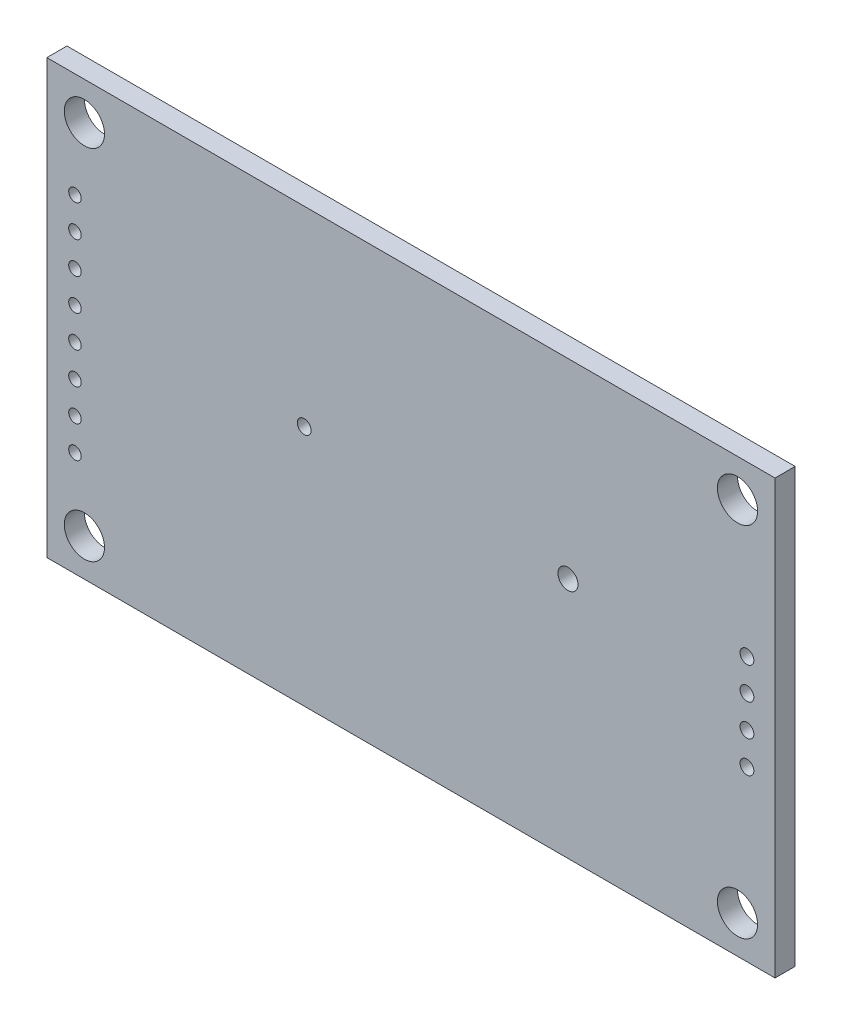
ISO-10303-21;
HEADER;
FILE_DESCRIPTION(('STEP AP214'),'2;1');
FILE_NAME('part.step','',(''),(''),'','','');
FILE_SCHEMA(('AUTOMOTIVE_DESIGN { 1 0 10303 214 1 1 1 1 }'));
ENDSEC;
DATA;
#1=APPLICATION_CONTEXT('core data for automotive mechanical design processes');
#2=APPLICATION_PROTOCOL_DEFINITION('international standard','automotive_design',2000,#1);
#3=PRODUCT_CONTEXT('',#1,'mechanical');
#4=PRODUCT('Part','Part','',(#3));
#5=PRODUCT_RELATED_PRODUCT_CATEGORY('part','',(#4));
#6=PRODUCT_DEFINITION_FORMATION('','',#4);
#7=PRODUCT_DEFINITION_CONTEXT('part definition',#1,'design');
#8=PRODUCT_DEFINITION('design','',#6,#7);
#9=PRODUCT_DEFINITION_SHAPE('','',#8);
#10=(LENGTH_UNIT() NAMED_UNIT(*) SI_UNIT(.MILLI.,.METRE.));
#11=(NAMED_UNIT(*) PLANE_ANGLE_UNIT() SI_UNIT($,.RADIAN.));
#12=(NAMED_UNIT(*) SI_UNIT($,.STERADIAN.) SOLID_ANGLE_UNIT());
#13=UNCERTAINTY_MEASURE_WITH_UNIT(LENGTH_MEASURE(1.E-05),#10,'distance_accuracy_value','');
#14=(GEOMETRIC_REPRESENTATION_CONTEXT(3) GLOBAL_UNCERTAINTY_ASSIGNED_CONTEXT((#13)) GLOBAL_UNIT_ASSIGNED_CONTEXT((#10,
#11,#12)) REPRESENTATION_CONTEXT('',''));
#15=CARTESIAN_POINT('',(0.,0.,0.));
#16=DIRECTION('',(0.,0.,1.));
#17=DIRECTION('',(1.,0.,0.));
#18=AXIS2_PLACEMENT_3D('',#15,#16,#17);
#19=CARTESIAN_POINT('',(29.000058420117,17.250034290069,1.600028244856));
#20=DIRECTION('',(0.,0.,-1.));
#21=DIRECTION('',(0.,-1.,0.));
#22=AXIS2_PLACEMENT_3D('',#19,#20,#21);
#23=PLANE('',#22);
#24=CARTESIAN_POINT('',(55.750111760224,18.520038100076,1.600028244856));
#25=DIRECTION('',(0.,0.,1.));
#26=DIRECTION('',(1.,0.,0.));
#27=AXIS2_PLACEMENT_3D('',#24,#25,#26);
#28=CIRCLE('',#27,0.550012700025);
#29=CARTESIAN_POINT('',(56.300124460249,18.520038100076,1.600028244856));
#30=VERTEX_POINT('',#29);
#31=EDGE_CURVE('E26',#30,#30,#28,.T.);
#32=ORIENTED_EDGE('',*,*,#31,.F.);
#33=EDGE_LOOP('',(#32));
#34=FACE_BOUND('',#33,.T.);
#35=CARTESIAN_POINT('',(55.750111760224,21.060043180086,1.600028244856));
#36=DIRECTION('',(0.,0.,1.));
#37=DIRECTION('',(1.,0.,0.));
#38=AXIS2_PLACEMENT_3D('',#35,#36,#37);
#39=CIRCLE('',#38,0.550012700025);
#40=CARTESIAN_POINT('',(56.300124460249,21.060043180086,1.600028244856));
#41=VERTEX_POINT('',#40);
#42=EDGE_CURVE('E20',#41,#41,#39,.T.);
#43=ORIENTED_EDGE('',*,*,#42,.F.);
#44=EDGE_LOOP('',(#43));
#45=FACE_BOUND('',#44,.T.);
#46=CARTESIAN_POINT('',(55.750111760224,13.440027940056,1.600028244856));
#47=DIRECTION('',(0.,0.,1.));
#48=DIRECTION('',(1.,0.,0.));
#49=AXIS2_PLACEMENT_3D('',#46,#47,#48);
#50=CIRCLE('',#49,0.550012700025);
#51=CARTESIAN_POINT('',(56.300124460249,13.440027940056,1.600028244856));
#52=VERTEX_POINT('',#51);
#53=EDGE_CURVE('E160',#52,#52,#50,.T.);
#54=ORIENTED_EDGE('',*,*,#53,.F.);
#55=EDGE_LOOP('',(#54));
#56=FACE_BOUND('',#55,.T.);
#57=CARTESIAN_POINT('',(55.750111760224,15.980033020066,1.600028244856));
#58=DIRECTION('',(0.,0.,1.));
#59=DIRECTION('',(1.,0.,0.));
#60=AXIS2_PLACEMENT_3D('',#57,#58,#59);
#61=CIRCLE('',#60,0.550012700025);
#62=CARTESIAN_POINT('',(56.300124460249,15.980033020066,1.600028244856));
#63=VERTEX_POINT('',#62);
#64=EDGE_CURVE('E139',#63,#63,#61,.T.);
#65=ORIENTED_EDGE('',*,*,#64,.F.);
#66=EDGE_LOOP('',(#65));
#67=FACE_BOUND('',#66,.T.);
#68=CARTESIAN_POINT('',(55.000109220218,31.500063500127,1.600028244856));
#69=DIRECTION('',(0.,0.,1.));
#70=DIRECTION('',(1.,0.,0.));
#71=AXIS2_PLACEMENT_3D('',#68,#69,#70);
#72=CIRCLE('',#71,1.600002540005);
#73=CARTESIAN_POINT('',(56.600111760223,31.500063500127,1.600028244856));
#74=VERTEX_POINT('',#73);
#75=EDGE_CURVE('E239',#74,#74,#72,.T.);
#76=ORIENTED_EDGE('',*,*,#75,.F.);
#77=EDGE_LOOP('',(#76));
#78=FACE_BOUND('',#77,.T.);
#79=CARTESIAN_POINT('',(55.000109220218,3.00000508001,1.600028244856));
#80=DIRECTION('',(0.,0.,1.));
#81=DIRECTION('',(1.,0.,0.));
#82=AXIS2_PLACEMENT_3D('',#79,#80,#81);
#83=CIRCLE('',#82,1.600002540005);
#84=CARTESIAN_POINT('',(56.600111760223,3.00000508001,1.600028244856));
#85=VERTEX_POINT('',#84);
#86=EDGE_CURVE('E116',#85,#85,#83,.T.);
#87=ORIENTED_EDGE('',*,*,#86,.F.);
#88=EDGE_LOOP('',(#87));
#89=FACE_BOUND('',#88,.T.);
#90=CARTESIAN_POINT('',(41.50016510033,19.288138176276,1.600028244856));
#91=DIRECTION('',(0.,0.,1.));
#92=DIRECTION('',(1.,0.,0.));
#93=AXIS2_PLACEMENT_3D('',#90,#91,#92);
#94=CIRCLE('',#93,0.8);
#95=CARTESIAN_POINT('',(42.30016510033,19.288138176276,1.600028244856));
#96=VERTEX_POINT('',#95);
#97=EDGE_CURVE('E223',#96,#96,#94,.T.);
#98=ORIENTED_EDGE('',*,*,#97,.F.);
#99=EDGE_LOOP('',(#98));
#100=FACE_BOUND('',#99,.T.);
#101=CARTESIAN_POINT('',(20.50016510033,19.288138176276,1.600028244856));
#102=DIRECTION('',(0.,0.,1.));
#103=DIRECTION('',(1.,0.,0.));
#104=AXIS2_PLACEMENT_3D('',#101,#102,#103);
#105=CIRCLE('',#104,0.550012700025);
#106=CARTESIAN_POINT('',(21.050177800355,19.288138176276,1.600028244856));
#107=VERTEX_POINT('',#106);
#108=EDGE_CURVE('E218',#107,#107,#105,.T.);
#109=ORIENTED_EDGE('',*,*,#108,.F.);
#110=EDGE_LOOP('',(#109));
#111=FACE_BOUND('',#110,.T.);
#112=CARTESIAN_POINT('',(2.25000508001,26.140053340107,1.600028244856));
#113=DIRECTION('',(0.,0.,1.));
#114=DIRECTION('',(1.,0.,0.));
#115=AXIS2_PLACEMENT_3D('',#112,#113,#114);
#116=CIRCLE('',#115,0.5);
#117=CARTESIAN_POINT('',(2.75000508001,26.140053340107,1.600028244856));
#118=VERTEX_POINT('',#117);
#119=EDGE_CURVE('E168',#118,#118,#116,.T.);
#120=ORIENTED_EDGE('',*,*,#119,.F.);
#121=EDGE_LOOP('',(#120));
#122=FACE_BOUND('',#121,.T.);
#123=CARTESIAN_POINT('',(2.25000508001,18.520038100076,1.600028244856));
#124=DIRECTION('',(0.,0.,1.));
#125=DIRECTION('',(1.,0.,0.));
#126=AXIS2_PLACEMENT_3D('',#123,#124,#125);
#127=CIRCLE('',#126,0.5);
#128=CARTESIAN_POINT('',(2.75000508001,18.520038100076,1.600028244856));
#129=VERTEX_POINT('',#128);
#130=EDGE_CURVE('E182',#129,#129,#127,.T.);
#131=ORIENTED_EDGE('',*,*,#130,.F.);
#132=EDGE_LOOP('',(#131));
#133=FACE_BOUND('',#132,.T.);
#134=CARTESIAN_POINT('',(2.25000508001,21.060043180086,1.600028244856));
#135=DIRECTION('',(0.,0.,1.));
#136=DIRECTION('',(1.,0.,0.));
#137=AXIS2_PLACEMENT_3D('',#134,#135,#136);
#138=CIRCLE('',#137,0.5);
#139=CARTESIAN_POINT('',(2.75000508001,21.060043180086,1.600028244856));
#140=VERTEX_POINT('',#139);
#141=EDGE_CURVE('E183',#140,#140,#138,.T.);
#142=ORIENTED_EDGE('',*,*,#141,.F.);
#143=EDGE_LOOP('',(#142));
#144=FACE_BOUND('',#143,.T.);
#145=CARTESIAN_POINT('',(2.25000508001,23.600048260097,1.600028244856));
#146=DIRECTION('',(0.,0.,1.));
#147=DIRECTION('',(1.,0.,0.));
#148=AXIS2_PLACEMENT_3D('',#145,#146,#147);
#149=CIRCLE('',#148,0.5);
#150=CARTESIAN_POINT('',(2.75000508001,23.600048260097,1.600028244856));
#151=VERTEX_POINT('',#150);
#152=EDGE_CURVE('E201',#151,#151,#149,.T.);
#153=ORIENTED_EDGE('',*,*,#152,.F.);
#154=EDGE_LOOP('',(#153));
#155=FACE_BOUND('',#154,.T.);
#156=CARTESIAN_POINT('',(2.25000508001,8.360017780036,1.600028244856));
#157=DIRECTION('',(0.,0.,1.));
#158=DIRECTION('',(1.,0.,0.));
#159=AXIS2_PLACEMENT_3D('',#156,#157,#158);
#160=CIRCLE('',#159,0.5);
#161=CARTESIAN_POINT('',(2.75000508001,8.360017780036,1.600028244856));
#162=VERTEX_POINT('',#161);
#163=EDGE_CURVE('E193',#162,#162,#160,.T.);
#164=ORIENTED_EDGE('',*,*,#163,.F.);
#165=EDGE_LOOP('',(#164));
#166=FACE_BOUND('',#165,.T.);
#167=CARTESIAN_POINT('',(2.25000508001,10.900022860046,1.600028244856));
#168=DIRECTION('',(0.,0.,1.));
#169=DIRECTION('',(1.,0.,0.));
#170=AXIS2_PLACEMENT_3D('',#167,#168,#169);
#171=CIRCLE('',#170,0.5);
#172=CARTESIAN_POINT('',(2.75000508001,10.900022860046,1.600028244856));
#173=VERTEX_POINT('',#172);
#174=EDGE_CURVE('E110',#173,#173,#171,.T.);
#175=ORIENTED_EDGE('',*,*,#174,.F.);
#176=EDGE_LOOP('',(#175));
#177=FACE_BOUND('',#176,.T.);
#178=CARTESIAN_POINT('',(2.25000508001,13.440027940056,1.600028244856));
#179=DIRECTION('',(0.,0.,1.));
#180=DIRECTION('',(1.,0.,0.));
#181=AXIS2_PLACEMENT_3D('',#178,#179,#180);
#182=CIRCLE('',#181,0.5);
#183=CARTESIAN_POINT('',(2.75000508001,13.440027940056,1.600028244856));
#184=VERTEX_POINT('',#183);
#185=EDGE_CURVE('E148',#184,#184,#182,.T.);
#186=ORIENTED_EDGE('',*,*,#185,.F.);
#187=EDGE_LOOP('',(#186));
#188=FACE_BOUND('',#187,.T.);
#189=CARTESIAN_POINT('',(2.25000508001,15.980033020066,1.600028244856));
#190=DIRECTION('',(0.,0.,1.));
#191=DIRECTION('',(1.,0.,0.));
#192=AXIS2_PLACEMENT_3D('',#189,#190,#191);
#193=CIRCLE('',#192,0.5);
#194=CARTESIAN_POINT('',(2.75000508001,15.980033020066,1.600028244856));
#195=VERTEX_POINT('',#194);
#196=EDGE_CURVE('E167',#195,#195,#193,.T.);
#197=ORIENTED_EDGE('',*,*,#196,.F.);
#198=EDGE_LOOP('',(#197));
#199=FACE_BOUND('',#198,.T.);
#200=CARTESIAN_POINT('',(3.00000508001,31.500063500127,1.600028244856));
#201=DIRECTION('',(0.,0.,1.));
#202=DIRECTION('',(1.,0.,0.));
#203=AXIS2_PLACEMENT_3D('',#200,#201,#202);
#204=CIRCLE('',#203,1.600002540005);
#205=CARTESIAN_POINT('',(4.600007620015,31.500063500127,1.600028244856));
#206=VERTEX_POINT('',#205);
#207=EDGE_CURVE('E124',#206,#206,#204,.T.);
#208=ORIENTED_EDGE('',*,*,#207,.F.);
#209=EDGE_LOOP('',(#208));
#210=FACE_BOUND('',#209,.T.);
#211=CARTESIAN_POINT('',(3.00000508001,3.00000508001,1.600028244856));
#212=DIRECTION('',(0.,0.,1.));
#213=DIRECTION('',(1.,0.,0.));
#214=AXIS2_PLACEMENT_3D('',#211,#212,#213);
#215=CIRCLE('',#214,1.600002540005);
#216=CARTESIAN_POINT('',(4.600007620015,3.00000508001,1.600028244856));
#217=VERTEX_POINT('',#216);
#218=EDGE_CURVE('E136',#217,#217,#215,.T.);
#219=ORIENTED_EDGE('',*,*,#218,.F.);
#220=EDGE_LOOP('',(#219));
#221=FACE_BOUND('',#220,.T.);
#222=DIRECTION('',(0.,-1.,0.));
#223=VECTOR('',#222,1.);
#224=CARTESIAN_POINT('',(57.987416814834,34.487368554737,1.600028244856));
#225=LINE('',#224,#223);
#226=CARTESIAN_POINT('',(57.987416814834,34.487368554737,1.600028244856));
#227=VERTEX_POINT('',#226);
#228=CARTESIAN_POINT('',(57.987416814834,0.01270002540005,1.600028244856));
#229=VERTEX_POINT('',#228);
#230=EDGE_CURVE('E106',#227,#229,#225,.T.);
#231=ORIENTED_EDGE('',*,*,#230,.F.);
#232=DIRECTION('',(1.,0.,0.));
#233=VECTOR('',#232,1.);
#234=CARTESIAN_POINT('',(0.01270002540005,34.487368554737,1.600028244856));
#235=LINE('',#234,#233);
#236=CARTESIAN_POINT('',(0.01270002540005,34.487368554737,1.600028244856));
#237=VERTEX_POINT('',#236);
#238=EDGE_CURVE('E49',#237,#227,#235,.T.);
#239=ORIENTED_EDGE('',*,*,#238,.F.);
#240=DIRECTION('',(0.,1.,0.));
#241=VECTOR('',#240,1.);
#242=CARTESIAN_POINT('',(0.01270002540005,0.01270002540005,1.600028244856));
#243=LINE('',#242,#241);
#244=CARTESIAN_POINT('',(0.01270002540005,0.01270002540005,1.600028244856));
#245=VERTEX_POINT('',#244);
#246=EDGE_CURVE('E72',#245,#237,#243,.T.);
#247=ORIENTED_EDGE('',*,*,#246,.F.);
#248=DIRECTION('',(-1.,0.,0.));
#249=VECTOR('',#248,1.);
#250=CARTESIAN_POINT('',(57.987416814834,0.01270002540005,1.600028244856));
#251=LINE('',#250,#249);
#252=EDGE_CURVE('E75',#229,#245,#251,.T.);
#253=ORIENTED_EDGE('',*,*,#252,.F.);
#254=EDGE_LOOP('',(#231,#239,#247,#253));
#255=FACE_BOUND('',#254,.T.);
#256=ADVANCED_FACE('F17',(#34,#45,#56,#67,#78,#89,#100,#111,#122,#133,#144,#155,#166,#177,#188,
#199,#210,#221,#255),#23,.F.);
#257=CARTESIAN_POINT('',(29.000058420117,17.250034290069,0.));
#258=DIRECTION('',(0.,0.,-1.));
#259=DIRECTION('',(0.,-1.,0.));
#260=AXIS2_PLACEMENT_3D('',#257,#258,#259);
#261=PLANE('',#260);
#262=CARTESIAN_POINT('',(55.750111760224,18.520038100076,0.));
#263=DIRECTION('',(0.,0.,1.));
#264=DIRECTION('',(-1.,0.,0.));
#265=AXIS2_PLACEMENT_3D('',#262,#263,#264);
#266=CIRCLE('',#265,0.550012700025);
#267=CARTESIAN_POINT('',(55.200099060199,18.520038100076,0.));
#268=VERTEX_POINT('',#267);
#269=EDGE_CURVE('E11',#268,#268,#266,.T.);
#270=ORIENTED_EDGE('',*,*,#269,.T.);
#271=EDGE_LOOP('',(#270));
#272=FACE_BOUND('',#271,.T.);
#273=CARTESIAN_POINT('',(55.750111760224,21.060043180086,0.));
#274=DIRECTION('',(0.,0.,1.));
#275=DIRECTION('',(-1.,0.,0.));
#276=AXIS2_PLACEMENT_3D('',#273,#274,#275);
#277=CIRCLE('',#276,0.550012700025);
#278=CARTESIAN_POINT('',(55.200099060199,21.060043180086,0.));
#279=VERTEX_POINT('',#278);
#280=EDGE_CURVE('E133',#279,#279,#277,.T.);
#281=ORIENTED_EDGE('',*,*,#280,.T.);
#282=EDGE_LOOP('',(#281));
#283=FACE_BOUND('',#282,.T.);
#284=CARTESIAN_POINT('',(55.750111760224,13.440027940056,0.));
#285=DIRECTION('',(0.,0.,1.));
#286=DIRECTION('',(-1.,0.,0.));
#287=AXIS2_PLACEMENT_3D('',#284,#285,#286);
#288=CIRCLE('',#287,0.550012700025);
#289=CARTESIAN_POINT('',(55.200099060199,13.440027940056,0.));
#290=VERTEX_POINT('',#289);
#291=EDGE_CURVE('E156',#290,#290,#288,.T.);
#292=ORIENTED_EDGE('',*,*,#291,.T.);
#293=EDGE_LOOP('',(#292));
#294=FACE_BOUND('',#293,.T.);
#295=CARTESIAN_POINT('',(55.750111760224,15.980033020066,0.));
#296=DIRECTION('',(0.,0.,1.));
#297=DIRECTION('',(-1.,0.,0.));
#298=AXIS2_PLACEMENT_3D('',#295,#296,#297);
#299=CIRCLE('',#298,0.550012700025);
#300=CARTESIAN_POINT('',(55.200099060199,15.980033020066,0.));
#301=VERTEX_POINT('',#300);
#302=EDGE_CURVE('E142',#301,#301,#299,.T.);
#303=ORIENTED_EDGE('',*,*,#302,.T.);
#304=EDGE_LOOP('',(#303));
#305=FACE_BOUND('',#304,.T.);
#306=CARTESIAN_POINT('',(55.000109220218,31.500063500127,0.));
#307=DIRECTION('',(0.,0.,1.));
#308=DIRECTION('',(-1.,0.,0.));
#309=AXIS2_PLACEMENT_3D('',#306,#307,#308);
#310=CIRCLE('',#309,1.600002540005);
#311=CARTESIAN_POINT('',(53.400106680213,31.500063500127,0.));
#312=VERTEX_POINT('',#311);
#313=EDGE_CURVE('E143',#312,#312,#310,.T.);
#314=ORIENTED_EDGE('',*,*,#313,.T.);
#315=EDGE_LOOP('',(#314));
#316=FACE_BOUND('',#315,.T.);
#317=CARTESIAN_POINT('',(55.000109220218,3.00000508001,0.));
#318=DIRECTION('',(0.,0.,1.));
#319=DIRECTION('',(-1.,0.,0.));
#320=AXIS2_PLACEMENT_3D('',#317,#318,#319);
#321=CIRCLE('',#320,1.600002540005);
#322=CARTESIAN_POINT('',(53.400106680213,3.00000508001,0.));
#323=VERTEX_POINT('',#322);
#324=EDGE_CURVE('E120',#323,#323,#321,.T.);
#325=ORIENTED_EDGE('',*,*,#324,.T.);
#326=EDGE_LOOP('',(#325));
#327=FACE_BOUND('',#326,.T.);
#328=CARTESIAN_POINT('',(41.50016510033,19.288138176276,0.));
#329=DIRECTION('',(0.,0.,1.));
#330=DIRECTION('',(-1.,0.,0.));
#331=AXIS2_PLACEMENT_3D('',#328,#329,#330);
#332=CIRCLE('',#331,0.8);
#333=CARTESIAN_POINT('',(40.70016510033,19.288138176276,0.));
#334=VERTEX_POINT('',#333);
#335=EDGE_CURVE('E121',#334,#334,#332,.T.);
#336=ORIENTED_EDGE('',*,*,#335,.T.);
#337=EDGE_LOOP('',(#336));
#338=FACE_BOUND('',#337,.T.);
#339=CARTESIAN_POINT('',(20.50016510033,19.288138176276,0.));
#340=DIRECTION('',(0.,0.,1.));
#341=DIRECTION('',(-1.,0.,0.));
#342=AXIS2_PLACEMENT_3D('',#339,#340,#341);
#343=CIRCLE('',#342,0.550012700025);
#344=CARTESIAN_POINT('',(19.950152400305,19.288138176276,0.));
#345=VERTEX_POINT('',#344);
#346=EDGE_CURVE('E222',#345,#345,#343,.T.);
#347=ORIENTED_EDGE('',*,*,#346,.T.);
#348=EDGE_LOOP('',(#347));
#349=FACE_BOUND('',#348,.T.);
#350=CARTESIAN_POINT('',(2.25000508001,26.140053340107,0.));
#351=DIRECTION('',(0.,0.,1.));
#352=DIRECTION('',(-1.,0.,0.));
#353=AXIS2_PLACEMENT_3D('',#350,#351,#352);
#354=CIRCLE('',#353,0.5);
#355=CARTESIAN_POINT('',(1.75000508001,26.140053340107,0.));
#356=VERTEX_POINT('',#355);
#357=EDGE_CURVE('E172',#356,#356,#354,.T.);
#358=ORIENTED_EDGE('',*,*,#357,.T.);
#359=EDGE_LOOP('',(#358));
#360=FACE_BOUND('',#359,.T.);
#361=CARTESIAN_POINT('',(2.25000508001,18.520038100076,0.));
#362=DIRECTION('',(0.,0.,1.));
#363=DIRECTION('',(-1.,0.,0.));
#364=AXIS2_PLACEMENT_3D('',#361,#362,#363);
#365=CIRCLE('',#364,0.5);
#366=CARTESIAN_POINT('',(1.75000508001,18.520038100076,0.));
#367=VERTEX_POINT('',#366);
#368=EDGE_CURVE('E173',#367,#367,#365,.T.);
#369=ORIENTED_EDGE('',*,*,#368,.T.);
#370=EDGE_LOOP('',(#369));
#371=FACE_BOUND('',#370,.T.);
#372=CARTESIAN_POINT('',(2.25000508001,21.060043180086,0.));
#373=DIRECTION('',(0.,0.,1.));
#374=DIRECTION('',(-1.,0.,0.));
#375=AXIS2_PLACEMENT_3D('',#372,#373,#374);
#376=CIRCLE('',#375,0.5);
#377=CARTESIAN_POINT('',(1.75000508001,21.060043180086,0.));
#378=VERTEX_POINT('',#377);
#379=EDGE_CURVE('E178',#378,#378,#376,.T.);
#380=ORIENTED_EDGE('',*,*,#379,.T.);
#381=EDGE_LOOP('',(#380));
#382=FACE_BOUND('',#381,.T.);
#383=CARTESIAN_POINT('',(2.25000508001,23.600048260097,0.));
#384=DIRECTION('',(0.,0.,1.));
#385=DIRECTION('',(-1.,0.,0.));
#386=AXIS2_PLACEMENT_3D('',#383,#384,#385);
#387=CIRCLE('',#386,0.5);
#388=CARTESIAN_POINT('',(1.75000508001,23.600048260097,0.));
#389=VERTEX_POINT('',#388);
#390=EDGE_CURVE('E205',#389,#389,#387,.T.);
#391=ORIENTED_EDGE('',*,*,#390,.T.);
#392=EDGE_LOOP('',(#391));
#393=FACE_BOUND('',#392,.T.);
#394=CARTESIAN_POINT('',(2.25000508001,8.360017780036,0.));
#395=DIRECTION('',(0.,0.,1.));
#396=DIRECTION('',(-1.,0.,0.));
#397=AXIS2_PLACEMENT_3D('',#394,#395,#396);
#398=CIRCLE('',#397,0.5);
#399=CARTESIAN_POINT('',(1.75000508001,8.360017780036,0.));
#400=VERTEX_POINT('',#399);
#401=EDGE_CURVE('E197',#400,#400,#398,.T.);
#402=ORIENTED_EDGE('',*,*,#401,.T.);
#403=EDGE_LOOP('',(#402));
#404=FACE_BOUND('',#403,.T.);
#405=CARTESIAN_POINT('',(2.25000508001,10.900022860046,0.));
#406=DIRECTION('',(0.,0.,1.));
#407=DIRECTION('',(-1.,0.,0.));
#408=AXIS2_PLACEMENT_3D('',#405,#406,#407);
#409=CIRCLE('',#408,0.5);
#410=CARTESIAN_POINT('',(1.75000508001,10.900022860046,0.));
#411=VERTEX_POINT('',#410);
#412=EDGE_CURVE('E113',#411,#411,#409,.T.);
#413=ORIENTED_EDGE('',*,*,#412,.T.);
#414=EDGE_LOOP('',(#413));
#415=FACE_BOUND('',#414,.T.);
#416=CARTESIAN_POINT('',(2.25000508001,13.440027940056,0.));
#417=DIRECTION('',(0.,0.,1.));
#418=DIRECTION('',(-1.,0.,0.));
#419=AXIS2_PLACEMENT_3D('',#416,#417,#418);
#420=CIRCLE('',#419,0.5);
#421=CARTESIAN_POINT('',(1.75000508001,13.440027940056,0.));
#422=VERTEX_POINT('',#421);
#423=EDGE_CURVE('E114',#422,#422,#420,.T.);
#424=ORIENTED_EDGE('',*,*,#423,.T.);
#425=EDGE_LOOP('',(#424));
#426=FACE_BOUND('',#425,.T.);
#427=CARTESIAN_POINT('',(2.25000508001,15.980033020066,0.));
#428=DIRECTION('',(0.,0.,1.));
#429=DIRECTION('',(-1.,0.,0.));
#430=AXIS2_PLACEMENT_3D('',#427,#428,#429);
#431=CIRCLE('',#430,0.5);
#432=CARTESIAN_POINT('',(1.75000508001,15.980033020066,0.));
#433=VERTEX_POINT('',#432);
#434=EDGE_CURVE('E176',#433,#433,#431,.T.);
#435=ORIENTED_EDGE('',*,*,#434,.T.);
#436=EDGE_LOOP('',(#435));
#437=FACE_BOUND('',#436,.T.);
#438=CARTESIAN_POINT('',(3.00000508001,31.500063500127,0.));
#439=DIRECTION('',(0.,0.,1.));
#440=DIRECTION('',(-1.,0.,0.));
#441=AXIS2_PLACEMENT_3D('',#438,#439,#440);
#442=CIRCLE('',#441,1.600002540005);
#443=CARTESIAN_POINT('',(1.400002540005,31.500063500127,0.));
#444=VERTEX_POINT('',#443);
#445=EDGE_CURVE('E127',#444,#444,#442,.T.);
#446=ORIENTED_EDGE('',*,*,#445,.T.);
#447=EDGE_LOOP('',(#446));
#448=FACE_BOUND('',#447,.T.);
#449=CARTESIAN_POINT('',(3.00000508001,3.00000508001,0.));
#450=DIRECTION('',(0.,0.,1.));
#451=DIRECTION('',(-1.,0.,0.));
#452=AXIS2_PLACEMENT_3D('',#449,#450,#451);
#453=CIRCLE('',#452,1.600002540005);
#454=CARTESIAN_POINT('',(1.400002540005,3.00000508001,0.));
#455=VERTEX_POINT('',#454);
#456=EDGE_CURVE('E128',#455,#455,#453,.T.);
#457=ORIENTED_EDGE('',*,*,#456,.T.);
#458=EDGE_LOOP('',(#457));
#459=FACE_BOUND('',#458,.T.);
#460=DIRECTION('',(0.,-1.,0.));
#461=VECTOR('',#460,1.);
#462=CARTESIAN_POINT('',(57.987416814834,34.487368554737,0.));
#463=LINE('',#462,#461);
#464=CARTESIAN_POINT('',(57.987416814834,34.487368554737,0.));
#465=VERTEX_POINT('',#464);
#466=CARTESIAN_POINT('',(57.987416814834,0.01270002540005,0.));
#467=VERTEX_POINT('',#466);
#468=EDGE_CURVE('E96',#465,#467,#463,.T.);
#469=ORIENTED_EDGE('',*,*,#468,.T.);
#470=DIRECTION('',(-1.,0.,0.));
#471=VECTOR('',#470,1.);
#472=CARTESIAN_POINT('',(57.987416814834,0.01270002540005,0.));
#473=LINE('',#472,#471);
#474=CARTESIAN_POINT('',(0.01270002540005,0.01270002540005,0.));
#475=VERTEX_POINT('',#474);
#476=EDGE_CURVE('E81',#467,#475,#473,.T.);
#477=ORIENTED_EDGE('',*,*,#476,.T.);
#478=DIRECTION('',(0.,1.,0.));
#479=VECTOR('',#478,1.);
#480=CARTESIAN_POINT('',(0.01270002540005,0.01270002540005,0.));
#481=LINE('',#480,#479);
#482=CARTESIAN_POINT('',(0.01270002540005,34.487368554737,0.));
#483=VERTEX_POINT('',#482);
#484=EDGE_CURVE('E86',#475,#483,#481,.T.);
#485=ORIENTED_EDGE('',*,*,#484,.T.);
#486=DIRECTION('',(1.,0.,0.));
#487=VECTOR('',#486,1.);
#488=CARTESIAN_POINT('',(0.01270002540005,34.487368554737,0.));
#489=LINE('',#488,#487);
#490=EDGE_CURVE('E39',#483,#465,#489,.T.);
#491=ORIENTED_EDGE('',*,*,#490,.T.);
#492=EDGE_LOOP('',(#469,#477,#485,#491));
#493=FACE_BOUND('',#492,.T.);
#494=ADVANCED_FACE('F258',(#272,#283,#294,#305,#316,#327,#338,#349,#360,#371,#382,#393,#404,
#415,#426,#437,#448,#459,#493),#261,.T.);
#495=CARTESIAN_POINT('',(55.750111760224,18.520038100076,0.));
#496=DIRECTION('',(0.,0.,-1.));
#497=DIRECTION('',(1.,0.,0.));
#498=AXIS2_PLACEMENT_3D('',#495,#496,#497);
#499=CYLINDRICAL_SURFACE('',#498,0.550012700025);
#500=ORIENTED_EDGE('',*,*,#269,.F.);
#501=EDGE_LOOP('',(#500));
#502=FACE_BOUND('',#501,.T.);
#503=ORIENTED_EDGE('',*,*,#31,.T.);
#504=EDGE_LOOP('',(#503));
#505=FACE_BOUND('',#504,.T.);
#506=ADVANCED_FACE('F355',(#502,#505),#499,.F.);
#507=CARTESIAN_POINT('',(55.750111760224,21.060043180086,0.));
#508=DIRECTION('',(0.,0.,-1.));
#509=DIRECTION('',(1.,0.,0.));
#510=AXIS2_PLACEMENT_3D('',#507,#508,#509);
#511=CYLINDRICAL_SURFACE('',#510,0.550012700025);
#512=ORIENTED_EDGE('',*,*,#280,.F.);
#513=EDGE_LOOP('',(#512));
#514=FACE_BOUND('',#513,.T.);
#515=ORIENTED_EDGE('',*,*,#42,.T.);
#516=EDGE_LOOP('',(#515));
#517=FACE_BOUND('',#516,.T.);
#518=ADVANCED_FACE('F351',(#514,#517),#511,.F.);
#519=CARTESIAN_POINT('',(55.750111760224,13.440027940056,0.));
#520=DIRECTION('',(0.,0.,-1.));
#521=DIRECTION('',(1.,0.,0.));
#522=AXIS2_PLACEMENT_3D('',#519,#520,#521);
#523=CYLINDRICAL_SURFACE('',#522,0.550012700025);
#524=ORIENTED_EDGE('',*,*,#291,.F.);
#525=EDGE_LOOP('',(#524));
#526=FACE_BOUND('',#525,.T.);
#527=ORIENTED_EDGE('',*,*,#53,.T.);
#528=EDGE_LOOP('',(#527));
#529=FACE_BOUND('',#528,.T.);
#530=ADVANCED_FACE('F254',(#526,#529),#523,.F.);
#531=CARTESIAN_POINT('',(55.750111760224,15.980033020066,0.));
#532=DIRECTION('',(0.,0.,-1.));
#533=DIRECTION('',(1.,0.,0.));
#534=AXIS2_PLACEMENT_3D('',#531,#532,#533);
#535=CYLINDRICAL_SURFACE('',#534,0.550012700025);
#536=ORIENTED_EDGE('',*,*,#302,.F.);
#537=EDGE_LOOP('',(#536));
#538=FACE_BOUND('',#537,.T.);
#539=ORIENTED_EDGE('',*,*,#64,.T.);
#540=EDGE_LOOP('',(#539));
#541=FACE_BOUND('',#540,.T.);
#542=ADVANCED_FACE('F311',(#538,#541),#535,.F.);
#543=CARTESIAN_POINT('',(55.000109220218,31.500063500127,0.));
#544=DIRECTION('',(0.,0.,-1.));
#545=DIRECTION('',(1.,0.,0.));
#546=AXIS2_PLACEMENT_3D('',#543,#544,#545);
#547=CYLINDRICAL_SURFACE('',#546,1.600002540005);
#548=ORIENTED_EDGE('',*,*,#313,.F.);
#549=EDGE_LOOP('',(#548));
#550=FACE_BOUND('',#549,.T.);
#551=ORIENTED_EDGE('',*,*,#75,.T.);
#552=EDGE_LOOP('',(#551));
#553=FACE_BOUND('',#552,.T.);
#554=ADVANCED_FACE('F307',(#550,#553),#547,.F.);
#555=CARTESIAN_POINT('',(55.000109220218,3.00000508001,0.));
#556=DIRECTION('',(0.,0.,-1.));
#557=DIRECTION('',(1.,0.,0.));
#558=AXIS2_PLACEMENT_3D('',#555,#556,#557);
#559=CYLINDRICAL_SURFACE('',#558,1.600002540005);
#560=ORIENTED_EDGE('',*,*,#324,.F.);
#561=EDGE_LOOP('',(#560));
#562=FACE_BOUND('',#561,.T.);
#563=ORIENTED_EDGE('',*,*,#86,.T.);
#564=EDGE_LOOP('',(#563));
#565=FACE_BOUND('',#564,.T.);
#566=ADVANCED_FACE('F310',(#562,#565),#559,.F.);
#567=CARTESIAN_POINT('',(41.50016510033,19.288138176276,0.));
#568=DIRECTION('',(0.,0.,-1.));
#569=DIRECTION('',(1.,0.,0.));
#570=AXIS2_PLACEMENT_3D('',#567,#568,#569);
#571=CYLINDRICAL_SURFACE('',#570,0.8);
#572=ORIENTED_EDGE('',*,*,#335,.F.);
#573=EDGE_LOOP('',(#572));
#574=FACE_BOUND('',#573,.T.);
#575=ORIENTED_EDGE('',*,*,#97,.T.);
#576=EDGE_LOOP('',(#575));
#577=FACE_BOUND('',#576,.T.);
#578=ADVANCED_FACE('F339',(#574,#577),#571,.F.);
#579=CARTESIAN_POINT('',(20.50016510033,19.288138176276,0.));
#580=DIRECTION('',(0.,0.,-1.));
#581=DIRECTION('',(1.,0.,0.));
#582=AXIS2_PLACEMENT_3D('',#579,#580,#581);
#583=CYLINDRICAL_SURFACE('',#582,0.550012700025);
#584=ORIENTED_EDGE('',*,*,#346,.F.);
#585=EDGE_LOOP('',(#584));
#586=FACE_BOUND('',#585,.T.);
#587=ORIENTED_EDGE('',*,*,#108,.T.);
#588=EDGE_LOOP('',(#587));
#589=FACE_BOUND('',#588,.T.);
#590=ADVANCED_FACE('F337',(#586,#589),#583,.F.);
#591=CARTESIAN_POINT('',(2.25000508001,26.140053340107,0.));
#592=DIRECTION('',(0.,0.,-1.));
#593=DIRECTION('',(1.,0.,0.));
#594=AXIS2_PLACEMENT_3D('',#591,#592,#593);
#595=CYLINDRICAL_SURFACE('',#594,0.5);
#596=ORIENTED_EDGE('',*,*,#357,.F.);
#597=EDGE_LOOP('',(#596));
#598=FACE_BOUND('',#597,.T.);
#599=ORIENTED_EDGE('',*,*,#119,.T.);
#600=EDGE_LOOP('',(#599));
#601=FACE_BOUND('',#600,.T.);
#602=ADVANCED_FACE('F334',(#598,#601),#595,.F.);
#603=CARTESIAN_POINT('',(2.25000508001,18.520038100076,0.));
#604=DIRECTION('',(0.,0.,-1.));
#605=DIRECTION('',(1.,0.,0.));
#606=AXIS2_PLACEMENT_3D('',#603,#604,#605);
#607=CYLINDRICAL_SURFACE('',#606,0.5);
#608=ORIENTED_EDGE('',*,*,#368,.F.);
#609=EDGE_LOOP('',(#608));
#610=FACE_BOUND('',#609,.T.);
#611=ORIENTED_EDGE('',*,*,#130,.T.);
#612=EDGE_LOOP('',(#611));
#613=FACE_BOUND('',#612,.T.);
#614=ADVANCED_FACE('F332',(#610,#613),#607,.F.);
#615=CARTESIAN_POINT('',(2.25000508001,21.060043180086,0.));
#616=DIRECTION('',(0.,0.,-1.));
#617=DIRECTION('',(1.,0.,0.));
#618=AXIS2_PLACEMENT_3D('',#615,#616,#617);
#619=CYLINDRICAL_SURFACE('',#618,0.5);
#620=ORIENTED_EDGE('',*,*,#379,.F.);
#621=EDGE_LOOP('',(#620));
#622=FACE_BOUND('',#621,.T.);
#623=ORIENTED_EDGE('',*,*,#141,.T.);
#624=EDGE_LOOP('',(#623));
#625=FACE_BOUND('',#624,.T.);
#626=ADVANCED_FACE('F329',(#622,#625),#619,.F.);
#627=CARTESIAN_POINT('',(2.25000508001,23.600048260097,0.));
#628=DIRECTION('',(0.,0.,-1.));
#629=DIRECTION('',(1.,0.,0.));
#630=AXIS2_PLACEMENT_3D('',#627,#628,#629);
#631=CYLINDRICAL_SURFACE('',#630,0.5);
#632=ORIENTED_EDGE('',*,*,#390,.F.);
#633=EDGE_LOOP('',(#632));
#634=FACE_BOUND('',#633,.T.);
#635=ORIENTED_EDGE('',*,*,#152,.T.);
#636=EDGE_LOOP('',(#635));
#637=FACE_BOUND('',#636,.T.);
#638=ADVANCED_FACE('F321',(#634,#637),#631,.F.);
#639=CARTESIAN_POINT('',(2.25000508001,8.360017780036,0.));
#640=DIRECTION('',(0.,0.,-1.));
#641=DIRECTION('',(1.,0.,0.));
#642=AXIS2_PLACEMENT_3D('',#639,#640,#641);
#643=CYLINDRICAL_SURFACE('',#642,0.5);
#644=ORIENTED_EDGE('',*,*,#401,.F.);
#645=EDGE_LOOP('',(#644));
#646=FACE_BOUND('',#645,.T.);
#647=ORIENTED_EDGE('',*,*,#163,.T.);
#648=EDGE_LOOP('',(#647));
#649=FACE_BOUND('',#648,.T.);
#650=ADVANCED_FACE('F317',(#646,#649),#643,.F.);
#651=CARTESIAN_POINT('',(2.25000508001,10.900022860046,0.));
#652=DIRECTION('',(0.,0.,-1.));
#653=DIRECTION('',(1.,0.,0.));
#654=AXIS2_PLACEMENT_3D('',#651,#652,#653);
#655=CYLINDRICAL_SURFACE('',#654,0.5);
#656=ORIENTED_EDGE('',*,*,#412,.F.);
#657=EDGE_LOOP('',(#656));
#658=FACE_BOUND('',#657,.T.);
#659=ORIENTED_EDGE('',*,*,#174,.T.);
#660=EDGE_LOOP('',(#659));
#661=FACE_BOUND('',#660,.T.);
#662=ADVANCED_FACE('F320',(#658,#661),#655,.F.);
#663=CARTESIAN_POINT('',(2.25000508001,13.440027940056,0.));
#664=DIRECTION('',(0.,0.,-1.));
#665=DIRECTION('',(1.,0.,0.));
#666=AXIS2_PLACEMENT_3D('',#663,#664,#665);
#667=CYLINDRICAL_SURFACE('',#666,0.5);
#668=ORIENTED_EDGE('',*,*,#423,.F.);
#669=EDGE_LOOP('',(#668));
#670=FACE_BOUND('',#669,.T.);
#671=ORIENTED_EDGE('',*,*,#185,.T.);
#672=EDGE_LOOP('',(#671));
#673=FACE_BOUND('',#672,.T.);
#674=ADVANCED_FACE('F315',(#670,#673),#667,.F.);
#675=CARTESIAN_POINT('',(2.25000508001,15.980033020066,0.));
#676=DIRECTION('',(0.,0.,-1.));
#677=DIRECTION('',(1.,0.,0.));
#678=AXIS2_PLACEMENT_3D('',#675,#676,#677);
#679=CYLINDRICAL_SURFACE('',#678,0.5);
#680=ORIENTED_EDGE('',*,*,#434,.F.);
#681=EDGE_LOOP('',(#680));
#682=FACE_BOUND('',#681,.T.);
#683=ORIENTED_EDGE('',*,*,#196,.T.);
#684=EDGE_LOOP('',(#683));
#685=FACE_BOUND('',#684,.T.);
#686=ADVANCED_FACE('F302',(#682,#685),#679,.F.);
#687=CARTESIAN_POINT('',(3.00000508001,31.500063500127,0.));
#688=DIRECTION('',(0.,0.,-1.));
#689=DIRECTION('',(1.,0.,0.));
#690=AXIS2_PLACEMENT_3D('',#687,#688,#689);
#691=CYLINDRICAL_SURFACE('',#690,1.600002540005);
#692=ORIENTED_EDGE('',*,*,#445,.F.);
#693=EDGE_LOOP('',(#692));
#694=FACE_BOUND('',#693,.T.);
#695=ORIENTED_EDGE('',*,*,#207,.T.);
#696=EDGE_LOOP('',(#695));
#697=FACE_BOUND('',#696,.T.);
#698=ADVANCED_FACE('F293',(#694,#697),#691,.F.);
#699=CARTESIAN_POINT('',(3.00000508001,3.00000508001,0.));
#700=DIRECTION('',(0.,0.,-1.));
#701=DIRECTION('',(1.,0.,0.));
#702=AXIS2_PLACEMENT_3D('',#699,#700,#701);
#703=CYLINDRICAL_SURFACE('',#702,1.600002540005);
#704=ORIENTED_EDGE('',*,*,#456,.F.);
#705=EDGE_LOOP('',(#704));
#706=FACE_BOUND('',#705,.T.);
#707=ORIENTED_EDGE('',*,*,#218,.T.);
#708=EDGE_LOOP('',(#707));
#709=FACE_BOUND('',#708,.T.);
#710=ADVANCED_FACE('F290',(#706,#709),#703,.F.);
#711=CARTESIAN_POINT('',(0.01270002540005,34.487368554737,0.));
#712=DIRECTION('',(0.,1.,0.));
#713=DIRECTION('',(1.,0.,0.));
#714=AXIS2_PLACEMENT_3D('',#711,#712,#713);
#715=PLANE('',#714);
#716=DIRECTION('',(0.,0.,1.));
#717=VECTOR('',#716,1.);
#718=CARTESIAN_POINT('',(0.01270002540005,34.487368554737,0.));
#719=LINE('',#718,#717);
#720=EDGE_CURVE('E80',#483,#237,#719,.T.);
#721=ORIENTED_EDGE('',*,*,#720,.T.);
#722=ORIENTED_EDGE('',*,*,#238,.T.);
#723=DIRECTION('',(0.,0.,1.));
#724=VECTOR('',#723,1.);
#725=CARTESIAN_POINT('',(57.987416814834,34.487368554737,0.));
#726=LINE('',#725,#724);
#727=EDGE_CURVE('E404',#465,#227,#726,.T.);
#728=ORIENTED_EDGE('',*,*,#727,.F.);
#729=ORIENTED_EDGE('',*,*,#490,.F.);
#730=EDGE_LOOP('',(#721,#722,#728,#729));
#731=FACE_BOUND('',#730,.T.);
#732=ADVANCED_FACE('F292',(#731),#715,.T.);
#733=CARTESIAN_POINT('',(0.01270002540005,0.01270002540005,0.));
#734=DIRECTION('',(-1.,0.,0.));
#735=DIRECTION('',(0.,0.,1.));
#736=AXIS2_PLACEMENT_3D('',#733,#734,#735);
#737=PLANE('',#736);
#738=DIRECTION('',(0.,0.,1.));
#739=VECTOR('',#738,1.);
#740=CARTESIAN_POINT('',(0.01270002540005,0.01270002540005,0.));
#741=LINE('',#740,#739);
#742=EDGE_CURVE('E84',#475,#245,#741,.T.);
#743=ORIENTED_EDGE('',*,*,#742,.T.);
#744=ORIENTED_EDGE('',*,*,#246,.T.);
#745=ORIENTED_EDGE('',*,*,#720,.F.);
#746=ORIENTED_EDGE('',*,*,#484,.F.);
#747=EDGE_LOOP('',(#743,#744,#745,#746));
#748=FACE_BOUND('',#747,.T.);
#749=ADVANCED_FACE('F85',(#748),#737,.T.);
#750=CARTESIAN_POINT('',(57.987416814834,0.01270002540005,0.));
#751=DIRECTION('',(0.,-1.,0.));
#752=DIRECTION('',(0.,0.,-1.));
#753=AXIS2_PLACEMENT_3D('',#750,#751,#752);
#754=PLANE('',#753);
#755=DIRECTION('',(0.,0.,1.));
#756=VECTOR('',#755,1.);
#757=CARTESIAN_POINT('',(57.987416814834,0.01270002540005,0.));
#758=LINE('',#757,#756);
#759=EDGE_CURVE('E93',#467,#229,#758,.T.);
#760=ORIENTED_EDGE('',*,*,#759,.T.);
#761=ORIENTED_EDGE('',*,*,#252,.T.);
#762=ORIENTED_EDGE('',*,*,#742,.F.);
#763=ORIENTED_EDGE('',*,*,#476,.F.);
#764=EDGE_LOOP('',(#760,#761,#762,#763));
#765=FACE_BOUND('',#764,.T.);
#766=ADVANCED_FACE('F91',(#765),#754,.T.);
#767=CARTESIAN_POINT('',(57.987416814834,34.487368554737,0.));
#768=DIRECTION('',(1.,0.,0.));
#769=DIRECTION('',(0.,1.,0.));
#770=AXIS2_PLACEMENT_3D('',#767,#768,#769);
#771=PLANE('',#770);
#772=ORIENTED_EDGE('',*,*,#727,.T.);
#773=ORIENTED_EDGE('',*,*,#230,.T.);
#774=ORIENTED_EDGE('',*,*,#759,.F.);
#775=ORIENTED_EDGE('',*,*,#468,.F.);
#776=EDGE_LOOP('',(#772,#773,#774,#775));
#777=FACE_BOUND('',#776,.T.);
#778=ADVANCED_FACE('F403',(#777),#771,.T.);
#779=CLOSED_SHELL('',(#256,#494,#506,#518,#530,#542,#554,#566,#578,#590,#602,#614,#626,#638,
#650,#662,#674,#686,#698,#710,#732,#749,#766,#778));
#780=MANIFOLD_SOLID_BREP('B1',#779);
#781=ADVANCED_BREP_SHAPE_REPRESENTATION('',(#18,#780),#14);
#782=SHAPE_DEFINITION_REPRESENTATION(#9,#781);
ENDSEC;
END-ISO-10303-21;
